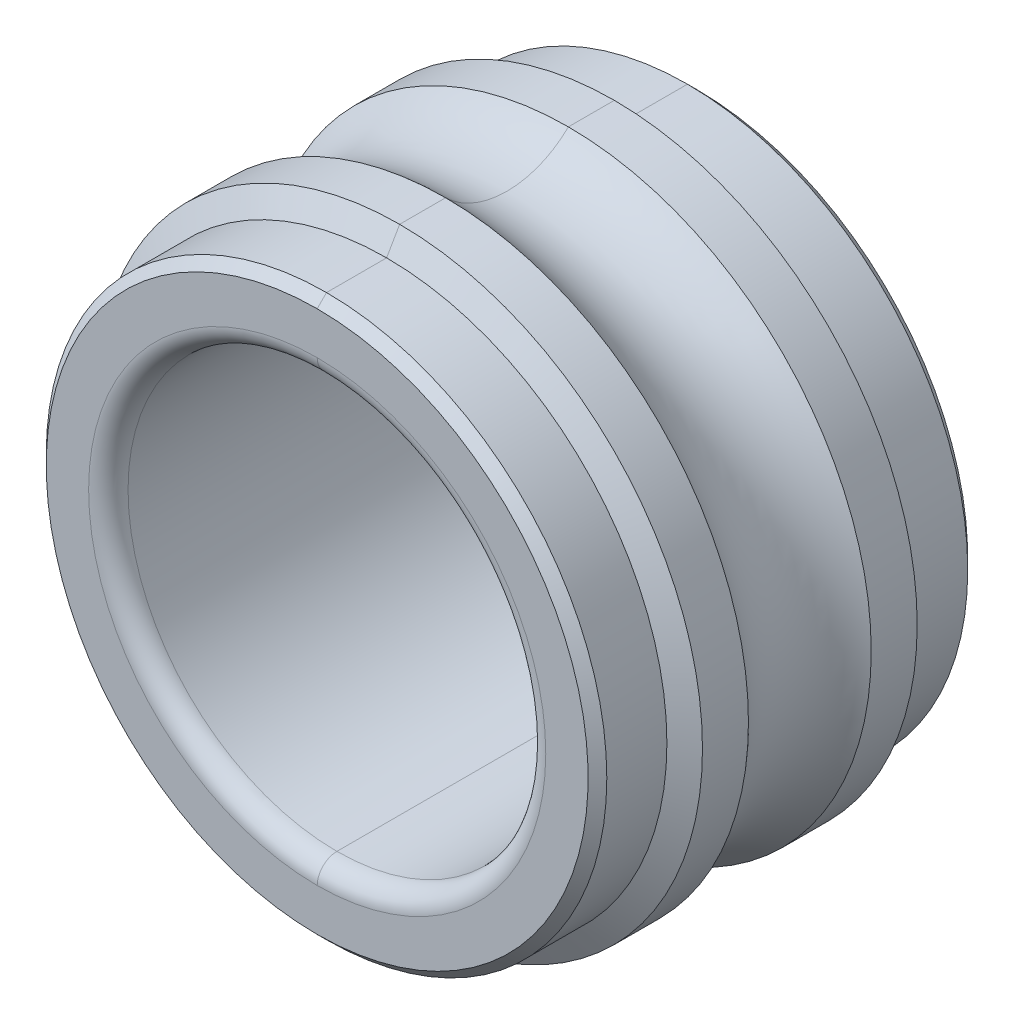
ISO-10303-21;
HEADER;
FILE_DESCRIPTION(('STEP AP214'),'2;1');
FILE_NAME('part.step','',(''),(''),'','','');
FILE_SCHEMA(('AUTOMOTIVE_DESIGN { 1 0 10303 214 1 1 1 1 }'));
ENDSEC;
DATA;
#1=APPLICATION_CONTEXT('core data for automotive mechanical design processes');
#2=APPLICATION_PROTOCOL_DEFINITION('international standard','automotive_design',2000,#1);
#3=PRODUCT_CONTEXT('',#1,'mechanical');
#4=PRODUCT('Part','Part','',(#3));
#5=PRODUCT_RELATED_PRODUCT_CATEGORY('part','',(#4));
#6=PRODUCT_DEFINITION_FORMATION('','',#4);
#7=PRODUCT_DEFINITION_CONTEXT('part definition',#1,'design');
#8=PRODUCT_DEFINITION('design','',#6,#7);
#9=PRODUCT_DEFINITION_SHAPE('','',#8);
#10=(LENGTH_UNIT() NAMED_UNIT(*) SI_UNIT(.MILLI.,.METRE.));
#11=(NAMED_UNIT(*) PLANE_ANGLE_UNIT() SI_UNIT($,.RADIAN.));
#12=(NAMED_UNIT(*) SI_UNIT($,.STERADIAN.) SOLID_ANGLE_UNIT());
#13=UNCERTAINTY_MEASURE_WITH_UNIT(LENGTH_MEASURE(1.E-05),#10,'distance_accuracy_value','');
#14=(GEOMETRIC_REPRESENTATION_CONTEXT(3) GLOBAL_UNCERTAINTY_ASSIGNED_CONTEXT((#13)) GLOBAL_UNIT_ASSIGNED_CONTEXT((#10,
#11,#12)) REPRESENTATION_CONTEXT('',''));
#15=CARTESIAN_POINT('',(0.,0.,0.));
#16=DIRECTION('',(0.,0.,1.));
#17=DIRECTION('',(1.,0.,0.));
#18=AXIS2_PLACEMENT_3D('',#15,#16,#17);
#19=CARTESIAN_POINT('',(0.,0.,2.58572));
#20=DIRECTION('',(0.,0.,-1.));
#21=DIRECTION('',(-0.00276370315342113,-0.999996180965147,0.));
#22=AXIS2_PLACEMENT_3D('',#19,#20,#21);
#23=TOROIDAL_SURFACE('',#22,3.47472,0.29972);
#24=CARTESIAN_POINT('',(0.,-3.47472,2.58572));
#25=DIRECTION('',(-1.,0.,0.));
#26=DIRECTION('',(0.,0.,1.));
#27=AXIS2_PLACEMENT_3D('',#24,#25,#26);
#28=CIRCLE('',#27,0.29972);
#29=CARTESIAN_POINT('',(0.,-3.47472,2.88544));
#30=VERTEX_POINT('',#29);
#31=CARTESIAN_POINT('',(0.,-3.175,2.58572));
#32=VERTEX_POINT('',#31);
#33=EDGE_CURVE('E20',#30,#32,#28,.T.);
#34=ORIENTED_EDGE('',*,*,#33,.F.);
#35=CARTESIAN_POINT('',(0.,0.,2.88544));
#36=DIRECTION('',(0.,0.,1.));
#37=DIRECTION('',(0.,-1.,0.));
#38=AXIS2_PLACEMENT_3D('',#35,#36,#37);
#39=CIRCLE('',#38,3.47472);
#40=CARTESIAN_POINT('',(0.00960309462125996,3.47470672992322,2.88544));
#41=VERTEX_POINT('',#40);
#42=EDGE_CURVE('E167',#30,#41,#39,.T.);
#43=ORIENTED_EDGE('',*,*,#42,.T.);
#44=CARTESIAN_POINT('',(0.,0.,2.88544));
#45=DIRECTION('',(0.,0.,-1.));
#46=DIRECTION('',(0.,1.,0.));
#47=AXIS2_PLACEMENT_3D('',#44,#45,#46);
#48=CIRCLE('',#47,3.47472);
#49=CARTESIAN_POINT('',(0.,3.47472,2.88544));
#50=VERTEX_POINT('',#49);
#51=EDGE_CURVE('E160',#50,#41,#48,.T.);
#52=ORIENTED_EDGE('',*,*,#51,.F.);
#53=CARTESIAN_POINT('',(0.,3.47472,2.58572));
#54=DIRECTION('',(1.,0.,0.));
#55=DIRECTION('',(0.,0.,1.));
#56=AXIS2_PLACEMENT_3D('',#53,#54,#55);
#57=CIRCLE('',#56,0.29972);
#58=CARTESIAN_POINT('',(0.,3.175,2.58572));
#59=VERTEX_POINT('',#58);
#60=EDGE_CURVE('E11',#50,#59,#57,.T.);
#61=ORIENTED_EDGE('',*,*,#60,.T.);
#62=CARTESIAN_POINT('',(0.,0.,2.58572));
#63=DIRECTION('',(0.,0.,1.));
#64=DIRECTION('',(0.00276370315342088,0.999996180965147,0.));
#65=AXIS2_PLACEMENT_3D('',#62,#63,#64);
#66=CIRCLE('',#65,3.175);
#67=CARTESIAN_POINT('',(0.0087747575121115,3.17498787456434,2.58572));
#68=VERTEX_POINT('',#67);
#69=EDGE_CURVE('E39',#68,#59,#66,.T.);
#70=ORIENTED_EDGE('',*,*,#69,.F.);
#71=CARTESIAN_POINT('',(0.,0.,2.58572));
#72=DIRECTION('',(0.,0.,1.));
#73=DIRECTION('',(0.,-1.,0.));
#74=AXIS2_PLACEMENT_3D('',#71,#72,#73);
#75=CIRCLE('',#74,3.175);
#76=EDGE_CURVE('E290',#32,#68,#75,.T.);
#77=ORIENTED_EDGE('',*,*,#76,.F.);
#78=EDGE_LOOP('',(#34,#43,#52,#61,#70,#77));
#79=FACE_BOUND('',#78,.T.);
#80=ADVANCED_FACE('F17',(#79),#23,.T.);
#81=CARTESIAN_POINT('',(0.,0.,2.58572));
#82=DIRECTION('',(0.,0.,-1.));
#83=DIRECTION('',(0.00276370315342113,0.999996180965147,0.));
#84=AXIS2_PLACEMENT_3D('',#81,#82,#83);
#85=TOROIDAL_SURFACE('',#84,3.47472,0.29972);
#86=ORIENTED_EDGE('',*,*,#60,.F.);
#87=CARTESIAN_POINT('',(0.,0.,2.88544));
#88=DIRECTION('',(0.,0.,1.));
#89=DIRECTION('',(0.,1.,0.));
#90=AXIS2_PLACEMENT_3D('',#87,#88,#89);
#91=CIRCLE('',#90,3.47472);
#92=CARTESIAN_POINT('',(-0.00960309462125996,-3.47470672992322,2.88544));
#93=VERTEX_POINT('',#92);
#94=EDGE_CURVE('E154',#50,#93,#91,.T.);
#95=ORIENTED_EDGE('',*,*,#94,.T.);
#96=CARTESIAN_POINT('',(0.,0.,2.88544));
#97=DIRECTION('',(0.,0.,-1.));
#98=DIRECTION('',(0.,-1.,0.));
#99=AXIS2_PLACEMENT_3D('',#96,#97,#98);
#100=CIRCLE('',#99,3.47472);
#101=EDGE_CURVE('E166',#30,#93,#100,.T.);
#102=ORIENTED_EDGE('',*,*,#101,.F.);
#103=ORIENTED_EDGE('',*,*,#33,.T.);
#104=CARTESIAN_POINT('',(0.,0.,2.58572));
#105=DIRECTION('',(0.,0.,1.));
#106=DIRECTION('',(-0.00276370315342112,-0.999996180965147,0.));
#107=AXIS2_PLACEMENT_3D('',#104,#105,#106);
#108=CIRCLE('',#107,3.175);
#109=CARTESIAN_POINT('',(-0.00877475751211189,-3.17498787456434,2.58572));
#110=VERTEX_POINT('',#109);
#111=EDGE_CURVE('E32',#110,#32,#108,.T.);
#112=ORIENTED_EDGE('',*,*,#111,.F.);
#113=CARTESIAN_POINT('',(0.,0.,2.58572));
#114=DIRECTION('',(0.,0.,1.));
#115=DIRECTION('',(0.,1.,0.));
#116=AXIS2_PLACEMENT_3D('',#113,#114,#115);
#117=CIRCLE('',#116,3.175);
#118=EDGE_CURVE('E291',#59,#110,#117,.T.);
#119=ORIENTED_EDGE('',*,*,#118,.F.);
#120=EDGE_LOOP('',(#86,#95,#102,#103,#112,#119));
#121=FACE_BOUND('',#120,.T.);
#122=ADVANCED_FACE('F302',(#121),#85,.T.);
#123=CARTESIAN_POINT('',(0.,0.,3.173984));
#124=DIRECTION('',(0.,0.,-1.));
#125=DIRECTION('',(0.,-1.,0.));
#126=AXIS2_PLACEMENT_3D('',#123,#124,#125);
#127=CYLINDRICAL_SURFACE('',#126,3.175);
#128=DIRECTION('',(0.,0.,1.));
#129=VECTOR('',#128,1.);
#130=CARTESIAN_POINT('',(0.,3.175,-2.58572));
#131=LINE('',#130,#129);
#132=CARTESIAN_POINT('',(0.,3.175,-2.58572));
#133=VERTEX_POINT('',#132);
#134=EDGE_CURVE('E282',#133,#59,#131,.T.);
#135=ORIENTED_EDGE('',*,*,#134,.T.);
#136=ORIENTED_EDGE('',*,*,#118,.T.);
#137=ORIENTED_EDGE('',*,*,#111,.T.);
#138=DIRECTION('',(0.,0.,1.));
#139=VECTOR('',#138,1.);
#140=CARTESIAN_POINT('',(0.,-3.175,-2.58572));
#141=LINE('',#140,#139);
#142=CARTESIAN_POINT('',(0.,-3.175,-2.58572));
#143=VERTEX_POINT('',#142);
#144=EDGE_CURVE('E287',#143,#32,#141,.T.);
#145=ORIENTED_EDGE('',*,*,#144,.F.);
#146=CARTESIAN_POINT('',(0.,0.,-2.58572));
#147=DIRECTION('',(0.,0.,-1.));
#148=DIRECTION('',(0.,-1.,0.));
#149=AXIS2_PLACEMENT_3D('',#146,#147,#148);
#150=CIRCLE('',#149,3.175);
#151=CARTESIAN_POINT('',(-0.0129637748972834,-3.17497353383306,-2.58572));
#152=VERTEX_POINT('',#151);
#153=EDGE_CURVE('E271',#143,#152,#150,.T.);
#154=ORIENTED_EDGE('',*,*,#153,.T.);
#155=CARTESIAN_POINT('',(0.,0.,-2.58572));
#156=DIRECTION('',(0.,0.,-1.));
#157=DIRECTION('',(-0.00408307870780573,-0.99999166419939,0.));
#158=AXIS2_PLACEMENT_3D('',#155,#156,#157);
#159=CIRCLE('',#158,3.175);
#160=EDGE_CURVE('E273',#152,#133,#159,.T.);
#161=ORIENTED_EDGE('',*,*,#160,.T.);
#162=EDGE_LOOP('',(#135,#136,#137,#145,#154,#161));
#163=FACE_BOUND('',#162,.T.);
#164=ADVANCED_FACE('F306',(#163),#127,.F.);
#165=CARTESIAN_POINT('',(0.,0.,3.173984));
#166=DIRECTION('',(0.,0.,-1.));
#167=DIRECTION('',(0.,-1.,0.));
#168=AXIS2_PLACEMENT_3D('',#165,#166,#167);
#169=CYLINDRICAL_SURFACE('',#168,3.175);
#170=ORIENTED_EDGE('',*,*,#144,.T.);
#171=ORIENTED_EDGE('',*,*,#76,.T.);
#172=ORIENTED_EDGE('',*,*,#69,.T.);
#173=ORIENTED_EDGE('',*,*,#134,.F.);
#174=CARTESIAN_POINT('',(0.,0.,-2.58572));
#175=DIRECTION('',(0.,0.,-1.));
#176=DIRECTION('',(0.,1.,0.));
#177=AXIS2_PLACEMENT_3D('',#174,#175,#176);
#178=CIRCLE('',#177,3.175);
#179=CARTESIAN_POINT('',(0.0129637748972831,3.17497353383306,-2.58572));
#180=VERTEX_POINT('',#179);
#181=EDGE_CURVE('E277',#133,#180,#178,.T.);
#182=ORIENTED_EDGE('',*,*,#181,.T.);
#183=CARTESIAN_POINT('',(0.,0.,-2.58572));
#184=DIRECTION('',(0.,0.,-1.));
#185=DIRECTION('',(0.00408307870780555,0.99999166419939,0.));
#186=AXIS2_PLACEMENT_3D('',#183,#184,#185);
#187=CIRCLE('',#186,3.175);
#188=EDGE_CURVE('E279',#180,#143,#187,.T.);
#189=ORIENTED_EDGE('',*,*,#188,.T.);
#190=EDGE_LOOP('',(#170,#171,#172,#173,#182,#189));
#191=FACE_BOUND('',#190,.T.);
#192=ADVANCED_FACE('F310',(#191),#169,.F.);
#193=CARTESIAN_POINT('',(0.,0.,-2.58572));
#194=DIRECTION('',(0.,0.,-1.));
#195=DIRECTION('',(-0.00408307870780596,-0.99999166419939,0.));
#196=AXIS2_PLACEMENT_3D('',#193,#194,#195);
#197=TOROIDAL_SURFACE('',#196,3.47472,0.29972);
#198=CARTESIAN_POINT('',(0.,-3.47472,-2.58572));
#199=DIRECTION('',(-1.,0.,0.));
#200=DIRECTION('',(0.,1.,0.));
#201=AXIS2_PLACEMENT_3D('',#198,#199,#200);
#202=CIRCLE('',#201,0.29972);
#203=CARTESIAN_POINT('',(0.,-3.47472,-2.88544));
#204=VERTEX_POINT('',#203);
#205=EDGE_CURVE('E266',#143,#204,#202,.T.);
#206=ORIENTED_EDGE('',*,*,#205,.F.);
#207=ORIENTED_EDGE('',*,*,#188,.F.);
#208=ORIENTED_EDGE('',*,*,#181,.F.);
#209=CARTESIAN_POINT('',(0.,3.47472,-2.58572));
#210=DIRECTION('',(1.,0.,0.));
#211=DIRECTION('',(0.,-1.,0.));
#212=AXIS2_PLACEMENT_3D('',#209,#210,#211);
#213=CIRCLE('',#212,0.29972);
#214=CARTESIAN_POINT('',(0.,3.47472,-2.88544));
#215=VERTEX_POINT('',#214);
#216=EDGE_CURVE('E275',#133,#215,#213,.T.);
#217=ORIENTED_EDGE('',*,*,#216,.T.);
#218=CARTESIAN_POINT('',(0.,0.,-2.88544));
#219=DIRECTION('',(0.,0.,-1.));
#220=DIRECTION('',(0.,1.,0.));
#221=AXIS2_PLACEMENT_3D('',#218,#219,#220);
#222=CIRCLE('',#221,3.47472);
#223=EDGE_CURVE('E264',#215,#204,#222,.T.);
#224=ORIENTED_EDGE('',*,*,#223,.T.);
#225=EDGE_LOOP('',(#206,#207,#208,#217,#224));
#226=FACE_BOUND('',#225,.T.);
#227=ADVANCED_FACE('F315',(#226),#197,.T.);
#228=CARTESIAN_POINT('',(0.,0.,-2.58572));
#229=DIRECTION('',(0.,0.,-1.));
#230=DIRECTION('',(0.00408307870780596,0.99999166419939,0.));
#231=AXIS2_PLACEMENT_3D('',#228,#229,#230);
#232=TOROIDAL_SURFACE('',#231,3.47472,0.29972);
#233=ORIENTED_EDGE('',*,*,#216,.F.);
#234=ORIENTED_EDGE('',*,*,#160,.F.);
#235=ORIENTED_EDGE('',*,*,#153,.F.);
#236=ORIENTED_EDGE('',*,*,#205,.T.);
#237=CARTESIAN_POINT('',(0.,0.,-2.88544));
#238=DIRECTION('',(0.,0.,-1.));
#239=DIRECTION('',(0.,-1.,0.));
#240=AXIS2_PLACEMENT_3D('',#237,#238,#239);
#241=CIRCLE('',#240,3.47472);
#242=EDGE_CURVE('E261',#204,#215,#241,.T.);
#243=ORIENTED_EDGE('',*,*,#242,.T.);
#244=EDGE_LOOP('',(#233,#234,#235,#236,#243));
#245=FACE_BOUND('',#244,.T.);
#246=ADVANCED_FACE('F320',(#245),#232,.T.);
#247=CARTESIAN_POINT('',(0.,0.,-2.8975254706707));
#248=DIRECTION('',(0.,0.,1.));
#249=DIRECTION('',(0.,1.,0.));
#250=AXIS2_PLACEMENT_3D('',#247,#248,#249);
#251=CONICAL_SURFACE('',#250,4.10673619599766,0.785398163397448);
#252=DIRECTION('',(0.,-0.707106781186547,0.707106781186547));
#253=VECTOR('',#252,1.);
#254=CARTESIAN_POINT('',(0.,-4.11882166666709,-2.88544000000127));
#255=LINE('',#254,#253);
#256=CARTESIAN_POINT('',(0.,-4.11882166666667,-2.88544000000085));
#257=VERTEX_POINT('',#256);
#258=CARTESIAN_POINT('',(0.,-4.26085000000063,-2.74341166666646));
#259=VERTEX_POINT('',#258);
#260=EDGE_CURVE('E250',#257,#259,#255,.T.);
#261=ORIENTED_EDGE('',*,*,#260,.T.);
#262=CARTESIAN_POINT('',(0.,0.,-2.7434116666671));
#263=DIRECTION('',(0.,0.,1.));
#264=DIRECTION('',(0.,1.,0.));
#265=AXIS2_PLACEMENT_3D('',#262,#263,#264);
#266=CIRCLE('',#265,4.26085000000126);
#267=CARTESIAN_POINT('',(0.,4.26085000000063,-2.74341166666646));
#268=VERTEX_POINT('',#267);
#269=EDGE_CURVE('E249',#268,#259,#266,.T.);
#270=ORIENTED_EDGE('',*,*,#269,.F.);
#271=DIRECTION('',(0.,0.707106781186547,0.707106781186547));
#272=VECTOR('',#271,1.);
#273=CARTESIAN_POINT('',(0.,4.11882166666709,-2.88544000000127));
#274=LINE('',#273,#272);
#275=CARTESIAN_POINT('',(0.,4.11882166666667,-2.88544000000085));
#276=VERTEX_POINT('',#275);
#277=EDGE_CURVE('E252',#276,#268,#274,.T.);
#278=ORIENTED_EDGE('',*,*,#277,.F.);
#279=CARTESIAN_POINT('',(0.,0.,-2.88544000000127));
#280=DIRECTION('',(0.,0.,1.));
#281=DIRECTION('',(0.,1.,0.));
#282=AXIS2_PLACEMENT_3D('',#279,#280,#281);
#283=CIRCLE('',#282,4.11882166666709);
#284=EDGE_CURVE('E259',#276,#257,#283,.T.);
#285=ORIENTED_EDGE('',*,*,#284,.T.);
#286=EDGE_LOOP('',(#261,#270,#278,#285));
#287=FACE_BOUND('',#286,.T.);
#288=ADVANCED_FACE('F326',(#287),#251,.T.);
#289=CARTESIAN_POINT('',(0.,0.,-2.88544));
#290=DIRECTION('',(0.,0.,-1.));
#291=DIRECTION('',(0.,-1.,0.));
#292=AXIS2_PLACEMENT_3D('',#289,#290,#291);
#293=PLANE('',#292);
#294=ORIENTED_EDGE('',*,*,#223,.F.);
#295=ORIENTED_EDGE('',*,*,#242,.F.);
#296=EDGE_LOOP('',(#294,#295));
#297=FACE_BOUND('',#296,.T.);
#298=ORIENTED_EDGE('',*,*,#284,.F.);
#299=CARTESIAN_POINT('',(0.,0.,-2.88544000000127));
#300=DIRECTION('',(0.,0.,1.));
#301=DIRECTION('',(0.,-1.,0.));
#302=AXIS2_PLACEMENT_3D('',#299,#300,#301);
#303=CIRCLE('',#302,4.11882166666709);
#304=EDGE_CURVE('E253',#257,#276,#303,.T.);
#305=ORIENTED_EDGE('',*,*,#304,.F.);
#306=EDGE_LOOP('',(#298,#305));
#307=FACE_BOUND('',#306,.T.);
#308=ADVANCED_FACE('F322',(#297,#307),#293,.T.);
#309=CARTESIAN_POINT('',(0.,0.,-2.8975254706707));
#310=DIRECTION('',(0.,0.,1.));
#311=DIRECTION('',(0.,1.,0.));
#312=AXIS2_PLACEMENT_3D('',#309,#310,#311);
#313=CONICAL_SURFACE('',#312,4.10673619599766,0.785398163397448);
#314=ORIENTED_EDGE('',*,*,#277,.T.);
#315=CARTESIAN_POINT('',(0.,0.,-2.7434116666671));
#316=DIRECTION('',(0.,0.,1.));
#317=DIRECTION('',(0.,-1.,0.));
#318=AXIS2_PLACEMENT_3D('',#315,#316,#317);
#319=CIRCLE('',#318,4.26085000000126);
#320=EDGE_CURVE('E254',#259,#268,#319,.T.);
#321=ORIENTED_EDGE('',*,*,#320,.F.);
#322=ORIENTED_EDGE('',*,*,#260,.F.);
#323=ORIENTED_EDGE('',*,*,#304,.T.);
#324=EDGE_LOOP('',(#314,#321,#322,#323));
#325=FACE_BOUND('',#324,.T.);
#326=ADVANCED_FACE('F325',(#325),#313,.T.);
#327=CARTESIAN_POINT('',(0.,0.,3.173984));
#328=DIRECTION('',(0.,0.,-1.));
#329=DIRECTION('',(0.,-1.,0.));
#330=AXIS2_PLACEMENT_3D('',#327,#328,#329);
#331=CYLINDRICAL_SURFACE('',#330,4.26085);
#332=CARTESIAN_POINT('',(0.,0.,-1.82992340730512));
#333=DIRECTION('',(0.,0.,-1.));
#334=DIRECTION('',(0.,1.,0.));
#335=AXIS2_PLACEMENT_3D('',#332,#333,#334);
#336=CIRCLE('',#335,4.26085);
#337=CARTESIAN_POINT('',(0.,4.26085,-1.82992340730512));
#338=VERTEX_POINT('',#337);
#339=CARTESIAN_POINT('',(0.,-4.26085,-1.82992340730512));
#340=VERTEX_POINT('',#339);
#341=EDGE_CURVE('E233',#338,#340,#336,.T.);
#342=ORIENTED_EDGE('',*,*,#341,.T.);
#343=DIRECTION('',(0.,0.,1.));
#344=VECTOR('',#343,1.);
#345=CARTESIAN_POINT('',(0.,-4.26085,-2.74341166666582));
#346=LINE('',#345,#344);
#347=EDGE_CURVE('E246',#259,#340,#346,.T.);
#348=ORIENTED_EDGE('',*,*,#347,.F.);
#349=ORIENTED_EDGE('',*,*,#320,.T.);
#350=DIRECTION('',(0.,0.,1.));
#351=VECTOR('',#350,1.);
#352=CARTESIAN_POINT('',(0.,4.26085,-2.74341166666582));
#353=LINE('',#352,#351);
#354=EDGE_CURVE('E242',#268,#338,#353,.T.);
#355=ORIENTED_EDGE('',*,*,#354,.T.);
#356=EDGE_LOOP('',(#342,#348,#349,#355));
#357=FACE_BOUND('',#356,.T.);
#358=ADVANCED_FACE('F341',(#357),#331,.T.);
#359=CARTESIAN_POINT('',(0.,0.,3.173984));
#360=DIRECTION('',(0.,0.,-1.));
#361=DIRECTION('',(0.,-1.,0.));
#362=AXIS2_PLACEMENT_3D('',#359,#360,#361);
#363=CYLINDRICAL_SURFACE('',#362,4.26085);
#364=ORIENTED_EDGE('',*,*,#269,.T.);
#365=ORIENTED_EDGE('',*,*,#347,.T.);
#366=CARTESIAN_POINT('',(0.,0.,-1.82992340730512));
#367=DIRECTION('',(0.,0.,-1.));
#368=DIRECTION('',(0.,-1.,0.));
#369=AXIS2_PLACEMENT_3D('',#366,#367,#368);
#370=CIRCLE('',#369,4.26085);
#371=EDGE_CURVE('E237',#340,#338,#370,.T.);
#372=ORIENTED_EDGE('',*,*,#371,.T.);
#373=ORIENTED_EDGE('',*,*,#354,.F.);
#374=EDGE_LOOP('',(#364,#365,#372,#373));
#375=FACE_BOUND('',#374,.T.);
#376=ADVANCED_FACE('F337',(#375),#363,.T.);
#377=CARTESIAN_POINT('',(0.,0.,-1.83846912556931));
#378=DIRECTION('',(0.,0.,1.));
#379=DIRECTION('',(0.,1.,0.));
#380=AXIS2_PLACEMENT_3D('',#377,#378,#379);
#381=CONICAL_SURFACE('',#380,4.24604838177926,1.0471975511966);
#382=DIRECTION('',(0.,0.866025403784438,0.5));
#383=VECTOR('',#382,1.);
#384=CARTESIAN_POINT('',(0.,4.26085,-1.82992340730512));
#385=LINE('',#384,#383);
#386=CARTESIAN_POINT('',(0.,4.60375,-1.63195));
#387=VERTEX_POINT('',#386);
#388=EDGE_CURVE('E232',#338,#387,#385,.T.);
#389=ORIENTED_EDGE('',*,*,#388,.F.);
#390=ORIENTED_EDGE('',*,*,#371,.F.);
#391=DIRECTION('',(0.,-0.866025403784438,0.5));
#392=VECTOR('',#391,1.);
#393=CARTESIAN_POINT('',(0.,-4.26085,-1.82992340730512));
#394=LINE('',#393,#392);
#395=CARTESIAN_POINT('',(0.,-4.60375,-1.63195));
#396=VERTEX_POINT('',#395);
#397=EDGE_CURVE('E235',#340,#396,#394,.T.);
#398=ORIENTED_EDGE('',*,*,#397,.T.);
#399=CARTESIAN_POINT('',(0.,0.,-1.63195));
#400=DIRECTION('',(0.,0.,1.));
#401=DIRECTION('',(0.,1.,0.));
#402=AXIS2_PLACEMENT_3D('',#399,#400,#401);
#403=CIRCLE('',#402,4.60375);
#404=EDGE_CURVE('E225',#387,#396,#403,.T.);
#405=ORIENTED_EDGE('',*,*,#404,.F.);
#406=EDGE_LOOP('',(#389,#390,#398,#405));
#407=FACE_BOUND('',#406,.T.);
#408=ADVANCED_FACE('F348',(#407),#381,.T.);
#409=CARTESIAN_POINT('',(0.,0.,-1.83846912556931));
#410=DIRECTION('',(0.,0.,1.));
#411=DIRECTION('',(0.,1.,0.));
#412=AXIS2_PLACEMENT_3D('',#409,#410,#411);
#413=CONICAL_SURFACE('',#412,4.24604838177926,1.0471975511966);
#414=ORIENTED_EDGE('',*,*,#397,.F.);
#415=ORIENTED_EDGE('',*,*,#341,.F.);
#416=ORIENTED_EDGE('',*,*,#388,.T.);
#417=CARTESIAN_POINT('',(0.,0.,-1.63195));
#418=DIRECTION('',(0.,0.,1.));
#419=DIRECTION('',(0.,-1.,0.));
#420=AXIS2_PLACEMENT_3D('',#417,#418,#419);
#421=CIRCLE('',#420,4.60375);
#422=EDGE_CURVE('E229',#396,#387,#421,.T.);
#423=ORIENTED_EDGE('',*,*,#422,.F.);
#424=EDGE_LOOP('',(#414,#415,#416,#423));
#425=FACE_BOUND('',#424,.T.);
#426=ADVANCED_FACE('F345',(#425),#413,.T.);
#427=CARTESIAN_POINT('',(0.,0.,3.173984));
#428=DIRECTION('',(0.,0.,-1.));
#429=DIRECTION('',(0.,-1.,0.));
#430=AXIS2_PLACEMENT_3D('',#427,#428,#429);
#431=CYLINDRICAL_SURFACE('',#430,4.60375);
#432=DIRECTION('',(0.,0.,-1.));
#433=VECTOR('',#432,1.);
#434=CARTESIAN_POINT('',(0.,-4.60375,-0.933255592000449));
#435=LINE('',#434,#433);
#436=CARTESIAN_POINT('',(0.,-4.60375000000001,-0.933255592000435));
#437=VERTEX_POINT('',#436);
#438=EDGE_CURVE('E218',#437,#396,#435,.T.);
#439=ORIENTED_EDGE('',*,*,#438,.T.);
#440=ORIENTED_EDGE('',*,*,#422,.T.);
#441=DIRECTION('',(0.,0.,-1.));
#442=VECTOR('',#441,1.);
#443=CARTESIAN_POINT('',(0.,4.60375,-0.933255592000449));
#444=LINE('',#443,#442);
#445=CARTESIAN_POINT('',(0.,4.60375000000001,-0.933255592000435));
#446=VERTEX_POINT('',#445);
#447=EDGE_CURVE('E226',#446,#387,#444,.T.);
#448=ORIENTED_EDGE('',*,*,#447,.F.);
#449=CARTESIAN_POINT('',(0.,0.,-0.93325559200042));
#450=DIRECTION('',(0.,0.,-1.));
#451=DIRECTION('',(0.,1.,0.));
#452=AXIS2_PLACEMENT_3D('',#449,#450,#451);
#453=CIRCLE('',#452,4.60375000000003);
#454=EDGE_CURVE('E193',#446,#437,#453,.T.);
#455=ORIENTED_EDGE('',*,*,#454,.T.);
#456=EDGE_LOOP('',(#439,#440,#448,#455));
#457=FACE_BOUND('',#456,.T.);
#458=ADVANCED_FACE('F355',(#457),#431,.T.);
#459=CARTESIAN_POINT('',(0.,0.,3.173984));
#460=DIRECTION('',(0.,0.,-1.));
#461=DIRECTION('',(0.,-1.,0.));
#462=AXIS2_PLACEMENT_3D('',#459,#460,#461);
#463=CYLINDRICAL_SURFACE('',#462,4.60375);
#464=ORIENTED_EDGE('',*,*,#447,.T.);
#465=ORIENTED_EDGE('',*,*,#404,.T.);
#466=ORIENTED_EDGE('',*,*,#438,.F.);
#467=CARTESIAN_POINT('',(0.,0.,-0.93325559200042));
#468=DIRECTION('',(0.,0.,-1.));
#469=DIRECTION('',(0.,-1.,0.));
#470=AXIS2_PLACEMENT_3D('',#467,#468,#469);
#471=CIRCLE('',#470,4.60375000000003);
#472=EDGE_CURVE('E210',#437,#446,#471,.T.);
#473=ORIENTED_EDGE('',*,*,#472,.T.);
#474=EDGE_LOOP('',(#464,#465,#466,#473));
#475=FACE_BOUND('',#474,.T.);
#476=ADVANCED_FACE('F351',(#475),#463,.T.);
#477=CARTESIAN_POINT('',(0.,0.,1.83846912556931));
#478=DIRECTION('',(0.,0.,-1.));
#479=DIRECTION('',(0.,-1.,0.));
#480=AXIS2_PLACEMENT_3D('',#477,#478,#479);
#481=CONICAL_SURFACE('',#480,4.24604838177926,1.0471975511966);
#482=DIRECTION('',(0.,0.866025403784438,0.5));
#483=VECTOR('',#482,1.);
#484=CARTESIAN_POINT('',(0.,-4.60375,1.63195));
#485=LINE('',#484,#483);
#486=CARTESIAN_POINT('',(0.,-4.60375,1.63195));
#487=VERTEX_POINT('',#486);
#488=CARTESIAN_POINT('',(0.,-4.26085,1.82992340730512));
#489=VERTEX_POINT('',#488);
#490=EDGE_CURVE('E183',#487,#489,#485,.T.);
#491=ORIENTED_EDGE('',*,*,#490,.T.);
#492=CARTESIAN_POINT('',(0.,0.,1.82992340730512));
#493=DIRECTION('',(0.,0.,1.));
#494=DIRECTION('',(0.,1.,0.));
#495=AXIS2_PLACEMENT_3D('',#492,#493,#494);
#496=CIRCLE('',#495,4.26085);
#497=CARTESIAN_POINT('',(0.,4.26085,1.82992340730512));
#498=VERTEX_POINT('',#497);
#499=EDGE_CURVE('E179',#498,#489,#496,.T.);
#500=ORIENTED_EDGE('',*,*,#499,.F.);
#501=DIRECTION('',(0.,-0.866025403784438,0.5));
#502=VECTOR('',#501,1.);
#503=CARTESIAN_POINT('',(0.,4.60375,1.63195));
#504=LINE('',#503,#502);
#505=CARTESIAN_POINT('',(0.,4.60375,1.63195));
#506=VERTEX_POINT('',#505);
#507=EDGE_CURVE('E186',#506,#498,#504,.T.);
#508=ORIENTED_EDGE('',*,*,#507,.F.);
#509=CARTESIAN_POINT('',(0.,0.,1.63195));
#510=DIRECTION('',(0.,0.,-1.));
#511=DIRECTION('',(0.,-1.,0.));
#512=AXIS2_PLACEMENT_3D('',#509,#510,#511);
#513=CIRCLE('',#512,4.60375);
#514=EDGE_CURVE('E213',#487,#506,#513,.T.);
#515=ORIENTED_EDGE('',*,*,#514,.F.);
#516=EDGE_LOOP('',(#491,#500,#508,#515));
#517=FACE_BOUND('',#516,.T.);
#518=ADVANCED_FACE('F374',(#517),#481,.T.);
#519=CARTESIAN_POINT('',(0.,0.,3.173984));
#520=DIRECTION('',(0.,0.,-1.));
#521=DIRECTION('',(0.,-1.,0.));
#522=AXIS2_PLACEMENT_3D('',#519,#520,#521);
#523=CYLINDRICAL_SURFACE('',#522,4.60375);
#524=DIRECTION('',(0.,0.,-1.));
#525=VECTOR('',#524,1.);
#526=CARTESIAN_POINT('',(0.,-4.60375,1.63195));
#527=LINE('',#526,#525);
#528=CARTESIAN_POINT('',(0.,-4.60375000000001,0.933255592000436));
#529=VERTEX_POINT('',#528);
#530=EDGE_CURVE('E192',#487,#529,#527,.T.);
#531=ORIENTED_EDGE('',*,*,#530,.F.);
#532=ORIENTED_EDGE('',*,*,#514,.T.);
#533=DIRECTION('',(0.,0.,-1.));
#534=VECTOR('',#533,1.);
#535=CARTESIAN_POINT('',(0.,4.60375,1.63195));
#536=LINE('',#535,#534);
#537=CARTESIAN_POINT('',(0.,4.60375000000001,0.933255592000436));
#538=VERTEX_POINT('',#537);
#539=EDGE_CURVE('E189',#506,#538,#536,.T.);
#540=ORIENTED_EDGE('',*,*,#539,.T.);
#541=CARTESIAN_POINT('',(0.,0.,0.933255592000423));
#542=DIRECTION('',(0.,0.,1.));
#543=DIRECTION('',(0.,1.,0.));
#544=AXIS2_PLACEMENT_3D('',#541,#542,#543);
#545=CIRCLE('',#544,4.60375000000003);
#546=EDGE_CURVE('E201',#538,#529,#545,.T.);
#547=ORIENTED_EDGE('',*,*,#546,.T.);
#548=EDGE_LOOP('',(#531,#532,#540,#547));
#549=FACE_BOUND('',#548,.T.);
#550=ADVANCED_FACE('F372',(#549),#523,.T.);
#551=CARTESIAN_POINT('',(0.,0.,0.));
#552=DIRECTION('',(0.,0.,-1.));
#553=DIRECTION('',(0.,-1.,0.));
#554=AXIS2_PLACEMENT_3D('',#551,#552,#553);
#555=TOROIDAL_SURFACE('',#554,5.55625,1.3335);
#556=ORIENTED_EDGE('',*,*,#472,.F.);
#557=CARTESIAN_POINT('',(0.,-5.55625,0.));
#558=DIRECTION('',(1.,0.,0.));
#559=DIRECTION('',(0.,0.714285714285692,-0.699854212223788));
#560=AXIS2_PLACEMENT_3D('',#557,#558,#559);
#561=CIRCLE('',#560,1.3335);
#562=CARTESIAN_POINT('',(0.,-4.22275,0.));
#563=VERTEX_POINT('',#562);
#564=EDGE_CURVE('E195',#437,#563,#561,.T.);
#565=ORIENTED_EDGE('',*,*,#564,.T.);
#566=CARTESIAN_POINT('',(0.,-5.55625,0.));
#567=DIRECTION('',(1.,0.,0.));
#568=DIRECTION('',(0.,1.,0.));
#569=AXIS2_PLACEMENT_3D('',#566,#567,#568);
#570=CIRCLE('',#569,1.3335);
#571=EDGE_CURVE('E198',#563,#529,#570,.T.);
#572=ORIENTED_EDGE('',*,*,#571,.T.);
#573=ORIENTED_EDGE('',*,*,#546,.F.);
#574=CARTESIAN_POINT('',(0.,5.55625,0.));
#575=DIRECTION('',(-1.,0.,0.));
#576=DIRECTION('',(0.,-1.,0.));
#577=AXIS2_PLACEMENT_3D('',#574,#575,#576);
#578=CIRCLE('',#577,1.3335);
#579=CARTESIAN_POINT('',(0.,4.22275,0.));
#580=VERTEX_POINT('',#579);
#581=EDGE_CURVE('E191',#580,#538,#578,.T.);
#582=ORIENTED_EDGE('',*,*,#581,.F.);
#583=CARTESIAN_POINT('',(0.,5.55625,0.));
#584=DIRECTION('',(-1.,0.,0.));
#585=DIRECTION('',(0.,-0.714285714285692,-0.699854212223788));
#586=AXIS2_PLACEMENT_3D('',#583,#584,#585);
#587=CIRCLE('',#586,1.3335);
#588=EDGE_CURVE('E196',#446,#580,#587,.T.);
#589=ORIENTED_EDGE('',*,*,#588,.F.);
#590=EDGE_LOOP('',(#556,#565,#572,#573,#582,#589));
#591=FACE_BOUND('',#590,.T.);
#592=ADVANCED_FACE('F363',(#591),#555,.F.);
#593=CARTESIAN_POINT('',(0.,0.,0.));
#594=DIRECTION('',(0.,0.,-1.));
#595=DIRECTION('',(0.,-1.,0.));
#596=AXIS2_PLACEMENT_3D('',#593,#594,#595);
#597=TOROIDAL_SURFACE('',#596,5.55625,1.3335);
#598=CARTESIAN_POINT('',(0.,0.,0.933255592000423));
#599=DIRECTION('',(0.,0.,1.));
#600=DIRECTION('',(0.,-1.,0.));
#601=AXIS2_PLACEMENT_3D('',#598,#599,#600);
#602=CIRCLE('',#601,4.60375000000003);
#603=EDGE_CURVE('E202',#529,#538,#602,.T.);
#604=ORIENTED_EDGE('',*,*,#603,.F.);
#605=ORIENTED_EDGE('',*,*,#571,.F.);
#606=ORIENTED_EDGE('',*,*,#564,.F.);
#607=ORIENTED_EDGE('',*,*,#454,.F.);
#608=ORIENTED_EDGE('',*,*,#588,.T.);
#609=ORIENTED_EDGE('',*,*,#581,.T.);
#610=EDGE_LOOP('',(#604,#605,#606,#607,#608,#609));
#611=FACE_BOUND('',#610,.T.);
#612=ADVANCED_FACE('F360',(#611),#597,.F.);
#613=CARTESIAN_POINT('',(0.,0.,3.173984));
#614=DIRECTION('',(0.,0.,-1.));
#615=DIRECTION('',(0.,-1.,0.));
#616=AXIS2_PLACEMENT_3D('',#613,#614,#615);
#617=CYLINDRICAL_SURFACE('',#616,4.60375);
#618=ORIENTED_EDGE('',*,*,#539,.F.);
#619=CARTESIAN_POINT('',(0.,0.,1.63195));
#620=DIRECTION('',(0.,0.,-1.));
#621=DIRECTION('',(0.,1.,0.));
#622=AXIS2_PLACEMENT_3D('',#619,#620,#621);
#623=CIRCLE('',#622,4.60375);
#624=EDGE_CURVE('E180',#506,#487,#623,.T.);
#625=ORIENTED_EDGE('',*,*,#624,.T.);
#626=ORIENTED_EDGE('',*,*,#530,.T.);
#627=ORIENTED_EDGE('',*,*,#603,.T.);
#628=EDGE_LOOP('',(#618,#625,#626,#627));
#629=FACE_BOUND('',#628,.T.);
#630=ADVANCED_FACE('F367',(#629),#617,.T.);
#631=CARTESIAN_POINT('',(0.,0.,1.83846912556931));
#632=DIRECTION('',(0.,0.,-1.));
#633=DIRECTION('',(0.,-1.,0.));
#634=AXIS2_PLACEMENT_3D('',#631,#632,#633);
#635=CONICAL_SURFACE('',#634,4.24604838177926,1.0471975511966);
#636=ORIENTED_EDGE('',*,*,#507,.T.);
#637=CARTESIAN_POINT('',(0.,0.,1.82992340730512));
#638=DIRECTION('',(0.,0.,1.));
#639=DIRECTION('',(0.,-1.,0.));
#640=AXIS2_PLACEMENT_3D('',#637,#638,#639);
#641=CIRCLE('',#640,4.26085);
#642=EDGE_CURVE('E184',#489,#498,#641,.T.);
#643=ORIENTED_EDGE('',*,*,#642,.F.);
#644=ORIENTED_EDGE('',*,*,#490,.F.);
#645=ORIENTED_EDGE('',*,*,#624,.F.);
#646=EDGE_LOOP('',(#636,#643,#644,#645));
#647=FACE_BOUND('',#646,.T.);
#648=ADVANCED_FACE('F377',(#647),#635,.T.);
#649=CARTESIAN_POINT('',(0.,0.,3.173984));
#650=DIRECTION('',(0.,0.,-1.));
#651=DIRECTION('',(0.,-1.,0.));
#652=AXIS2_PLACEMENT_3D('',#649,#650,#651);
#653=CYLINDRICAL_SURFACE('',#652,4.26085);
#654=CARTESIAN_POINT('',(0.,0.,2.7434116666671));
#655=DIRECTION('',(0.,0.,-1.));
#656=DIRECTION('',(0.,1.,0.));
#657=AXIS2_PLACEMENT_3D('',#654,#655,#656);
#658=CIRCLE('',#657,4.26085000000126);
#659=CARTESIAN_POINT('',(0.,4.26085000000063,2.74341166666646));
#660=VERTEX_POINT('',#659);
#661=CARTESIAN_POINT('',(0.,-4.26085000000063,2.74341166666646));
#662=VERTEX_POINT('',#661);
#663=EDGE_CURVE('E159',#660,#662,#658,.T.);
#664=ORIENTED_EDGE('',*,*,#663,.T.);
#665=DIRECTION('',(0.,0.,1.));
#666=VECTOR('',#665,1.);
#667=CARTESIAN_POINT('',(0.,-4.26085,1.82992340730512));
#668=LINE('',#667,#666);
#669=EDGE_CURVE('E176',#489,#662,#668,.T.);
#670=ORIENTED_EDGE('',*,*,#669,.F.);
#671=ORIENTED_EDGE('',*,*,#642,.T.);
#672=DIRECTION('',(0.,0.,1.));
#673=VECTOR('',#672,1.);
#674=CARTESIAN_POINT('',(0.,4.26085,1.82992340730512));
#675=LINE('',#674,#673);
#676=EDGE_CURVE('E173',#498,#660,#675,.T.);
#677=ORIENTED_EDGE('',*,*,#676,.T.);
#678=EDGE_LOOP('',(#664,#670,#671,#677));
#679=FACE_BOUND('',#678,.T.);
#680=ADVANCED_FACE('F381',(#679),#653,.T.);
#681=CARTESIAN_POINT('',(0.,0.,3.173984));
#682=DIRECTION('',(0.,0.,-1.));
#683=DIRECTION('',(0.,-1.,0.));
#684=AXIS2_PLACEMENT_3D('',#681,#682,#683);
#685=CYLINDRICAL_SURFACE('',#684,4.26085);
#686=ORIENTED_EDGE('',*,*,#499,.T.);
#687=ORIENTED_EDGE('',*,*,#669,.T.);
#688=CARTESIAN_POINT('',(0.,0.,2.7434116666671));
#689=DIRECTION('',(0.,0.,-1.));
#690=DIRECTION('',(0.,-1.,0.));
#691=AXIS2_PLACEMENT_3D('',#688,#689,#690);
#692=CIRCLE('',#691,4.26085000000126);
#693=EDGE_CURVE('E171',#662,#660,#692,.T.);
#694=ORIENTED_EDGE('',*,*,#693,.T.);
#695=ORIENTED_EDGE('',*,*,#676,.F.);
#696=EDGE_LOOP('',(#686,#687,#694,#695));
#697=FACE_BOUND('',#696,.T.);
#698=ADVANCED_FACE('F383',(#697),#685,.T.);
#699=CARTESIAN_POINT('',(0.,0.,2.8975254706707));
#700=DIRECTION('',(0.,0.,-1.));
#701=DIRECTION('',(0.,-1.,0.));
#702=AXIS2_PLACEMENT_3D('',#699,#700,#701);
#703=CONICAL_SURFACE('',#702,4.10673619599766,0.785398163397448);
#704=DIRECTION('',(0.,-0.707106781186547,0.707106781186547));
#705=VECTOR('',#704,1.);
#706=CARTESIAN_POINT('',(0.,4.26085000000126,2.74341166666709));
#707=LINE('',#706,#705);
#708=CARTESIAN_POINT('',(0.,4.11882166666667,2.88544000000085));
#709=VERTEX_POINT('',#708);
#710=EDGE_CURVE('E147',#660,#709,#707,.T.);
#711=ORIENTED_EDGE('',*,*,#710,.F.);
#712=ORIENTED_EDGE('',*,*,#693,.F.);
#713=DIRECTION('',(0.,0.707106781186547,0.707106781186547));
#714=VECTOR('',#713,1.);
#715=CARTESIAN_POINT('',(0.,-4.26085000000126,2.74341166666709));
#716=LINE('',#715,#714);
#717=CARTESIAN_POINT('',(0.,-4.11882166666667,2.88544000000085));
#718=VERTEX_POINT('',#717);
#719=EDGE_CURVE('E150',#662,#718,#716,.T.);
#720=ORIENTED_EDGE('',*,*,#719,.T.);
#721=CARTESIAN_POINT('',(0.,0.,2.88544000000127));
#722=DIRECTION('',(0.,0.,-1.));
#723=DIRECTION('',(0.,-1.,0.));
#724=AXIS2_PLACEMENT_3D('',#721,#722,#723);
#725=CIRCLE('',#724,4.11882166666709);
#726=EDGE_CURVE('E143',#718,#709,#725,.T.);
#727=ORIENTED_EDGE('',*,*,#726,.T.);
#728=EDGE_LOOP('',(#711,#712,#720,#727));
#729=FACE_BOUND('',#728,.T.);
#730=ADVANCED_FACE('F145',(#729),#703,.T.);
#731=CARTESIAN_POINT('',(0.,0.,2.8975254706707));
#732=DIRECTION('',(0.,0.,-1.));
#733=DIRECTION('',(0.,-1.,0.));
#734=AXIS2_PLACEMENT_3D('',#731,#732,#733);
#735=CONICAL_SURFACE('',#734,4.10673619599766,0.785398163397448);
#736=ORIENTED_EDGE('',*,*,#719,.F.);
#737=ORIENTED_EDGE('',*,*,#663,.F.);
#738=ORIENTED_EDGE('',*,*,#710,.T.);
#739=CARTESIAN_POINT('',(0.,0.,2.88544000000127));
#740=DIRECTION('',(0.,0.,-1.));
#741=DIRECTION('',(0.,1.,0.));
#742=AXIS2_PLACEMENT_3D('',#739,#740,#741);
#743=CIRCLE('',#742,4.11882166666709);
#744=EDGE_CURVE('E155',#709,#718,#743,.T.);
#745=ORIENTED_EDGE('',*,*,#744,.T.);
#746=EDGE_LOOP('',(#736,#737,#738,#745));
#747=FACE_BOUND('',#746,.T.);
#748=ADVANCED_FACE('F158',(#747),#735,.T.);
#749=CARTESIAN_POINT('',(0.,0.,2.88544));
#750=DIRECTION('',(0.,0.,-1.));
#751=DIRECTION('',(0.,-1.,0.));
#752=AXIS2_PLACEMENT_3D('',#749,#750,#751);
#753=PLANE('',#752);
#754=ORIENTED_EDGE('',*,*,#51,.T.);
#755=ORIENTED_EDGE('',*,*,#42,.F.);
#756=ORIENTED_EDGE('',*,*,#101,.T.);
#757=ORIENTED_EDGE('',*,*,#94,.F.);
#758=EDGE_LOOP('',(#754,#755,#756,#757));
#759=FACE_BOUND('',#758,.T.);
#760=ORIENTED_EDGE('',*,*,#726,.F.);
#761=ORIENTED_EDGE('',*,*,#744,.F.);
#762=EDGE_LOOP('',(#760,#761));
#763=FACE_BOUND('',#762,.T.);
#764=ADVANCED_FACE('F162',(#759,#763),#753,.F.);
#765=CLOSED_SHELL('',(#80,#122,#164,#192,#227,#246,#288,#308,#326,#358,#376,#408,#426,#458,#476,
#518,#550,#592,#612,#630,#648,#680,#698,#730,#748,#764));
#766=MANIFOLD_SOLID_BREP('B1',#765);
#767=ADVANCED_BREP_SHAPE_REPRESENTATION('',(#18,#766),#14);
#768=SHAPE_DEFINITION_REPRESENTATION(#9,#767);
ENDSEC;
END-ISO-10303-21;
